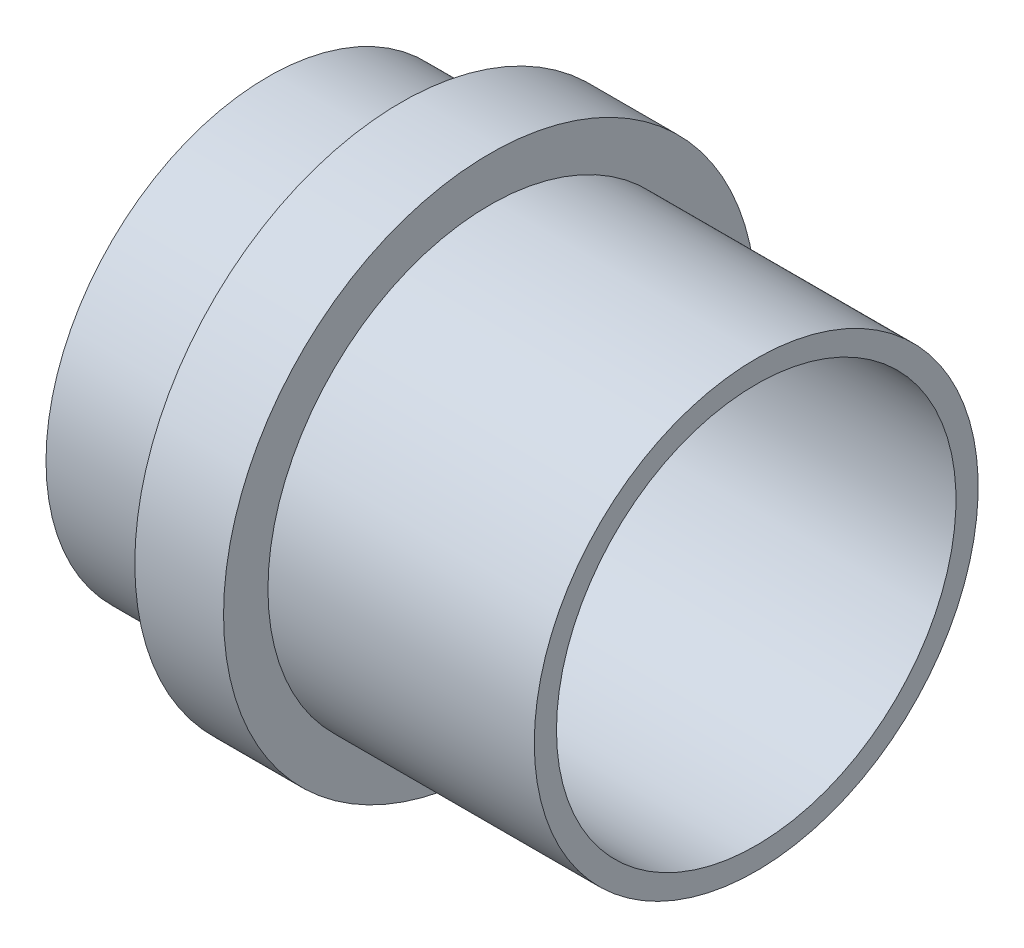
ISO-10303-21;
HEADER;
FILE_DESCRIPTION(('STEP AP214'),'2;1');
FILE_NAME('part.step','',(''),(''),'','','');
FILE_SCHEMA(('AUTOMOTIVE_DESIGN { 1 0 10303 214 1 1 1 1 }'));
ENDSEC;
DATA;
#1=APPLICATION_CONTEXT('core data for automotive mechanical design processes');
#2=APPLICATION_PROTOCOL_DEFINITION('international standard','automotive_design',2000,#1);
#3=PRODUCT_CONTEXT('',#1,'mechanical');
#4=PRODUCT('Part','Part','',(#3));
#5=PRODUCT_RELATED_PRODUCT_CATEGORY('part','',(#4));
#6=PRODUCT_DEFINITION_FORMATION('','',#4);
#7=PRODUCT_DEFINITION_CONTEXT('part definition',#1,'design');
#8=PRODUCT_DEFINITION('design','',#6,#7);
#9=PRODUCT_DEFINITION_SHAPE('','',#8);
#10=(LENGTH_UNIT() NAMED_UNIT(*) SI_UNIT(.MILLI.,.METRE.));
#11=(NAMED_UNIT(*) PLANE_ANGLE_UNIT() SI_UNIT($,.RADIAN.));
#12=(NAMED_UNIT(*) SI_UNIT($,.STERADIAN.) SOLID_ANGLE_UNIT());
#13=UNCERTAINTY_MEASURE_WITH_UNIT(LENGTH_MEASURE(1.E-05),#10,'distance_accuracy_value','');
#14=(GEOMETRIC_REPRESENTATION_CONTEXT(3) GLOBAL_UNCERTAINTY_ASSIGNED_CONTEXT((#13)) GLOBAL_UNIT_ASSIGNED_CONTEXT((#10,
#11,#12)) REPRESENTATION_CONTEXT('',''));
#15=CARTESIAN_POINT('',(0.,0.,0.));
#16=DIRECTION('',(0.,0.,1.));
#17=DIRECTION('',(1.,0.,0.));
#18=AXIS2_PLACEMENT_3D('',#15,#16,#17);
#19=CARTESIAN_POINT('',(0.,0.,0.));
#20=DIRECTION('',(-1.,0.,0.));
#21=DIRECTION('',(0.,0.,1.));
#22=AXIS2_PLACEMENT_3D('',#19,#20,#21);
#23=CYLINDRICAL_SURFACE('',#22,57.15);
#24=CARTESIAN_POINT('',(0.,0.,0.));
#25=DIRECTION('',(-1.,0.,0.));
#26=DIRECTION('',(0.,0.,1.));
#27=AXIS2_PLACEMENT_3D('',#24,#25,#26);
#28=CIRCLE('',#27,57.15);
#29=CARTESIAN_POINT('',(0.,0.,57.15));
#30=VERTEX_POINT('',#29);
#31=EDGE_CURVE('E78',#30,#30,#28,.T.);
#32=ORIENTED_EDGE('',*,*,#31,.T.);
#33=EDGE_LOOP('',(#32));
#34=FACE_BOUND('',#33,.T.);
#35=CARTESIAN_POINT('',(139.7,0.,0.));
#36=DIRECTION('',(-1.,0.,0.));
#37=DIRECTION('',(0.,0.,1.));
#38=AXIS2_PLACEMENT_3D('',#35,#36,#37);
#39=CIRCLE('',#38,57.15);
#40=CARTESIAN_POINT('',(139.7,0.,57.15));
#41=VERTEX_POINT('',#40);
#42=EDGE_CURVE('E10',#41,#41,#39,.T.);
#43=ORIENTED_EDGE('',*,*,#42,.F.);
#44=EDGE_LOOP('',(#43));
#45=FACE_BOUND('',#44,.T.);
#46=ADVANCED_FACE('F43',(#34,#45),#23,.F.);
#47=CARTESIAN_POINT('',(139.7,0.,0.));
#48=DIRECTION('',(-1.,0.,0.));
#49=DIRECTION('',(0.,0.,1.));
#50=AXIS2_PLACEMENT_3D('',#47,#48,#49);
#51=PLANE('',#50);
#52=CARTESIAN_POINT('',(139.7,0.,0.));
#53=DIRECTION('',(-1.,0.,0.));
#54=DIRECTION('',(0.,0.,1.));
#55=AXIS2_PLACEMENT_3D('',#52,#53,#54);
#56=CIRCLE('',#55,63.5);
#57=CARTESIAN_POINT('',(139.7,0.,63.5));
#58=VERTEX_POINT('',#57);
#59=EDGE_CURVE('E50',#58,#58,#56,.T.);
#60=ORIENTED_EDGE('',*,*,#59,.F.);
#61=EDGE_LOOP('',(#60));
#62=FACE_BOUND('',#61,.T.);
#63=ORIENTED_EDGE('',*,*,#42,.T.);
#64=EDGE_LOOP('',(#63));
#65=FACE_BOUND('',#64,.T.);
#66=ADVANCED_FACE('F97',(#62,#65),#51,.F.);
#67=CARTESIAN_POINT('',(0.,0.,0.));
#68=DIRECTION('',(-1.,0.,0.));
#69=DIRECTION('',(0.,0.,1.));
#70=AXIS2_PLACEMENT_3D('',#67,#68,#69);
#71=CYLINDRICAL_SURFACE('',#70,63.5);
#72=ORIENTED_EDGE('',*,*,#59,.T.);
#73=EDGE_LOOP('',(#72));
#74=FACE_BOUND('',#73,.T.);
#75=CARTESIAN_POINT('',(63.5,0.,0.));
#76=DIRECTION('',(-1.,0.,0.));
#77=DIRECTION('',(0.,0.,1.));
#78=AXIS2_PLACEMENT_3D('',#75,#76,#77);
#79=CIRCLE('',#78,63.5);
#80=CARTESIAN_POINT('',(63.5,0.,63.5));
#81=VERTEX_POINT('',#80);
#82=EDGE_CURVE('E55',#81,#81,#79,.T.);
#83=ORIENTED_EDGE('',*,*,#82,.F.);
#84=EDGE_LOOP('',(#83));
#85=FACE_BOUND('',#84,.T.);
#86=ADVANCED_FACE('F101',(#74,#85),#71,.T.);
#87=CARTESIAN_POINT('',(63.5,0.,0.));
#88=DIRECTION('',(-1.,0.,0.));
#89=DIRECTION('',(0.,0.,1.));
#90=AXIS2_PLACEMENT_3D('',#87,#88,#89);
#91=PLANE('',#90);
#92=CARTESIAN_POINT('',(63.5,0.,0.));
#93=DIRECTION('',(-1.,0.,0.));
#94=DIRECTION('',(0.,0.,1.));
#95=AXIS2_PLACEMENT_3D('',#92,#93,#94);
#96=CIRCLE('',#95,76.2);
#97=CARTESIAN_POINT('',(63.5,0.,76.2));
#98=VERTEX_POINT('',#97);
#99=EDGE_CURVE('E60',#98,#98,#96,.T.);
#100=ORIENTED_EDGE('',*,*,#99,.F.);
#101=EDGE_LOOP('',(#100));
#102=FACE_BOUND('',#101,.T.);
#103=ORIENTED_EDGE('',*,*,#82,.T.);
#104=EDGE_LOOP('',(#103));
#105=FACE_BOUND('',#104,.T.);
#106=ADVANCED_FACE('F106',(#102,#105),#91,.F.);
#107=CARTESIAN_POINT('',(0.,0.,0.));
#108=DIRECTION('',(-1.,0.,0.));
#109=DIRECTION('',(0.,0.,1.));
#110=AXIS2_PLACEMENT_3D('',#107,#108,#109);
#111=CYLINDRICAL_SURFACE('',#110,76.2);
#112=ORIENTED_EDGE('',*,*,#99,.T.);
#113=EDGE_LOOP('',(#112));
#114=FACE_BOUND('',#113,.T.);
#115=CARTESIAN_POINT('',(38.1,0.,0.));
#116=DIRECTION('',(-1.,0.,0.));
#117=DIRECTION('',(0.,0.,1.));
#118=AXIS2_PLACEMENT_3D('',#115,#116,#117);
#119=CIRCLE('',#118,76.2);
#120=CARTESIAN_POINT('',(38.1,0.,76.2));
#121=VERTEX_POINT('',#120);
#122=EDGE_CURVE('E66',#121,#121,#119,.T.);
#123=ORIENTED_EDGE('',*,*,#122,.F.);
#124=EDGE_LOOP('',(#123));
#125=FACE_BOUND('',#124,.T.);
#126=ADVANCED_FACE('F111',(#114,#125),#111,.T.);
#127=CARTESIAN_POINT('',(38.1,0.,0.));
#128=DIRECTION('',(-1.,0.,0.));
#129=DIRECTION('',(0.,0.,1.));
#130=AXIS2_PLACEMENT_3D('',#127,#128,#129);
#131=PLANE('',#130);
#132=ORIENTED_EDGE('',*,*,#122,.T.);
#133=EDGE_LOOP('',(#132));
#134=FACE_BOUND('',#133,.T.);
#135=CARTESIAN_POINT('',(38.1,0.,0.));
#136=DIRECTION('',(-1.,0.,0.));
#137=DIRECTION('',(0.,0.,1.));
#138=AXIS2_PLACEMENT_3D('',#135,#136,#137);
#139=CIRCLE('',#138,63.5);
#140=CARTESIAN_POINT('',(38.1,0.,63.5));
#141=VERTEX_POINT('',#140);
#142=EDGE_CURVE('E70',#141,#141,#139,.T.);
#143=ORIENTED_EDGE('',*,*,#142,.F.);
#144=EDGE_LOOP('',(#143));
#145=FACE_BOUND('',#144,.T.);
#146=ADVANCED_FACE('F93',(#134,#145),#131,.T.);
#147=CARTESIAN_POINT('',(0.,0.,0.));
#148=DIRECTION('',(-1.,0.,0.));
#149=DIRECTION('',(0.,0.,1.));
#150=AXIS2_PLACEMENT_3D('',#147,#148,#149);
#151=CYLINDRICAL_SURFACE('',#150,63.5);
#152=ORIENTED_EDGE('',*,*,#142,.T.);
#153=EDGE_LOOP('',(#152));
#154=FACE_BOUND('',#153,.T.);
#155=CARTESIAN_POINT('',(0.,0.,0.));
#156=DIRECTION('',(-1.,0.,0.));
#157=DIRECTION('',(0.,0.,1.));
#158=AXIS2_PLACEMENT_3D('',#155,#156,#157);
#159=CIRCLE('',#158,63.5);
#160=CARTESIAN_POINT('',(0.,0.,63.5));
#161=VERTEX_POINT('',#160);
#162=EDGE_CURVE('E74',#161,#161,#159,.T.);
#163=ORIENTED_EDGE('',*,*,#162,.F.);
#164=EDGE_LOOP('',(#163));
#165=FACE_BOUND('',#164,.T.);
#166=ADVANCED_FACE('F87',(#154,#165),#151,.T.);
#167=CARTESIAN_POINT('',(0.,0.,0.));
#168=DIRECTION('',(-1.,0.,0.));
#169=DIRECTION('',(0.,0.,1.));
#170=AXIS2_PLACEMENT_3D('',#167,#168,#169);
#171=PLANE('',#170);
#172=ORIENTED_EDGE('',*,*,#162,.T.);
#173=EDGE_LOOP('',(#172));
#174=FACE_BOUND('',#173,.T.);
#175=ORIENTED_EDGE('',*,*,#31,.F.);
#176=EDGE_LOOP('',(#175));
#177=FACE_BOUND('',#176,.T.);
#178=ADVANCED_FACE('F85',(#174,#177),#171,.T.);
#179=CLOSED_SHELL('',(#46,#66,#86,#106,#126,#146,#166,#178));
#180=MANIFOLD_SOLID_BREP('B2',#179);
#181=ADVANCED_BREP_SHAPE_REPRESENTATION('',(#18,#180),#14);
#182=SHAPE_DEFINITION_REPRESENTATION(#9,#181);
ENDSEC;
END-ISO-10303-21;
